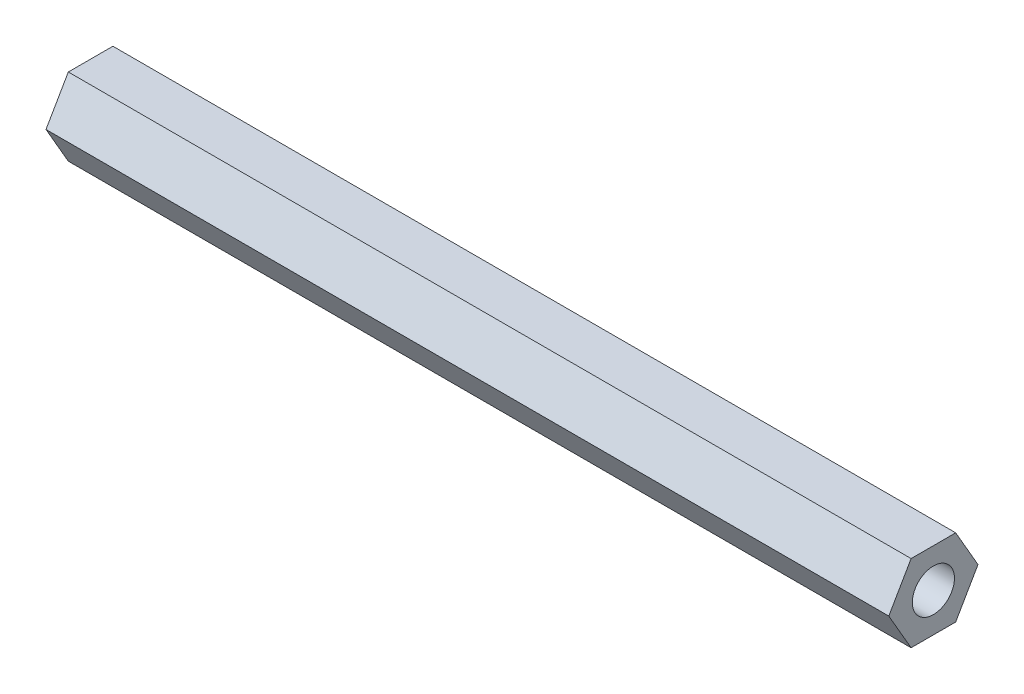
ISO-10303-21;
HEADER;
FILE_DESCRIPTION(('STEP AP214'),'2;1');
FILE_NAME('part.step','',(''),(''),'','','');
FILE_SCHEMA(('AUTOMOTIVE_DESIGN { 1 0 10303 214 1 1 1 1 }'));
ENDSEC;
DATA;
#1=APPLICATION_CONTEXT('core data for automotive mechanical design processes');
#2=APPLICATION_PROTOCOL_DEFINITION('international standard','automotive_design',2000,#1);
#3=PRODUCT_CONTEXT('',#1,'mechanical');
#4=PRODUCT('Part','Part','',(#3));
#5=PRODUCT_RELATED_PRODUCT_CATEGORY('part','',(#4));
#6=PRODUCT_DEFINITION_FORMATION('','',#4);
#7=PRODUCT_DEFINITION_CONTEXT('part definition',#1,'design');
#8=PRODUCT_DEFINITION('design','',#6,#7);
#9=PRODUCT_DEFINITION_SHAPE('','',#8);
#10=(LENGTH_UNIT() NAMED_UNIT(*) SI_UNIT(.MILLI.,.METRE.));
#11=(NAMED_UNIT(*) PLANE_ANGLE_UNIT() SI_UNIT($,.RADIAN.));
#12=(NAMED_UNIT(*) SI_UNIT($,.STERADIAN.) SOLID_ANGLE_UNIT());
#13=UNCERTAINTY_MEASURE_WITH_UNIT(LENGTH_MEASURE(1.E-05),#10,'distance_accuracy_value','');
#14=(GEOMETRIC_REPRESENTATION_CONTEXT(3) GLOBAL_UNCERTAINTY_ASSIGNED_CONTEXT((#13)) GLOBAL_UNIT_ASSIGNED_CONTEXT((#10,
#11,#12)) REPRESENTATION_CONTEXT('',''));
#15=CARTESIAN_POINT('',(0.,0.,0.));
#16=DIRECTION('',(0.,0.,1.));
#17=DIRECTION('',(1.,0.,0.));
#18=AXIS2_PLACEMENT_3D('',#15,#16,#17);
#19=CARTESIAN_POINT('',(60.,-2.75,-1.58771324027147));
#20=DIRECTION('',(0.,0.5,0.866025403784439));
#21=DIRECTION('',(0.,-0.866025403784439,0.5));
#22=AXIS2_PLACEMENT_3D('',#19,#20,#21);
#23=PLANE('',#22);
#24=DIRECTION('',(0.,0.866025403784439,-0.5));
#25=VECTOR('',#24,1.);
#26=CARTESIAN_POINT('',(0.,-2.75,-1.58771324027147));
#27=LINE('',#26,#25);
#28=CARTESIAN_POINT('',(0.,-2.75,-1.58771324027147));
#29=VERTEX_POINT('',#28);
#30=CARTESIAN_POINT('',(0.,0.,-3.17542648054294));
#31=VERTEX_POINT('',#30);
#32=EDGE_CURVE('E127',#29,#31,#27,.T.);
#33=ORIENTED_EDGE('',*,*,#32,.T.);
#34=DIRECTION('',(-1.,0.,0.));
#35=VECTOR('',#34,1.);
#36=CARTESIAN_POINT('',(60.,0.,-3.17542648054294));
#37=LINE('',#36,#35);
#38=CARTESIAN_POINT('',(60.,0.,-3.17542648054294));
#39=VERTEX_POINT('',#38);
#40=EDGE_CURVE('E11',#39,#31,#37,.T.);
#41=ORIENTED_EDGE('',*,*,#40,.F.);
#42=DIRECTION('',(0.,0.866025403784439,-0.5));
#43=VECTOR('',#42,1.);
#44=CARTESIAN_POINT('',(60.,-2.75,-1.58771324027147));
#45=LINE('',#44,#43);
#46=CARTESIAN_POINT('',(60.,-2.75,-1.58771324027147));
#47=VERTEX_POINT('',#46);
#48=EDGE_CURVE('E139',#47,#39,#45,.T.);
#49=ORIENTED_EDGE('',*,*,#48,.F.);
#50=DIRECTION('',(-1.,0.,0.));
#51=VECTOR('',#50,1.);
#52=CARTESIAN_POINT('',(60.,-2.75,-1.58771324027147));
#53=LINE('',#52,#51);
#54=EDGE_CURVE('E124',#47,#29,#53,.T.);
#55=ORIENTED_EDGE('',*,*,#54,.T.);
#56=EDGE_LOOP('',(#33,#41,#49,#55));
#57=FACE_BOUND('',#56,.T.);
#58=ADVANCED_FACE('F41',(#57),#23,.F.);
#59=CARTESIAN_POINT('',(60.,0.,-3.17542648054294));
#60=DIRECTION('',(0.,-0.5,0.866025403784439));
#61=DIRECTION('',(0.,-0.866025403784439,-0.5));
#62=AXIS2_PLACEMENT_3D('',#59,#60,#61);
#63=PLANE('',#62);
#64=DIRECTION('',(0.,0.866025403784439,0.5));
#65=VECTOR('',#64,1.);
#66=CARTESIAN_POINT('',(0.,0.,-3.17542648054294));
#67=LINE('',#66,#65);
#68=CARTESIAN_POINT('',(0.,2.75,-1.58771324027147));
#69=VERTEX_POINT('',#68);
#70=EDGE_CURVE('E129',#31,#69,#67,.T.);
#71=ORIENTED_EDGE('',*,*,#70,.T.);
#72=DIRECTION('',(-1.,0.,0.));
#73=VECTOR('',#72,1.);
#74=CARTESIAN_POINT('',(60.,2.75,-1.58771324027147));
#75=LINE('',#74,#73);
#76=CARTESIAN_POINT('',(60.,2.75,-1.58771324027147));
#77=VERTEX_POINT('',#76);
#78=EDGE_CURVE('E49',#77,#69,#75,.T.);
#79=ORIENTED_EDGE('',*,*,#78,.F.);
#80=DIRECTION('',(0.,0.866025403784439,0.5));
#81=VECTOR('',#80,1.);
#82=CARTESIAN_POINT('',(60.,0.,-3.17542648054294));
#83=LINE('',#82,#81);
#84=EDGE_CURVE('E92',#39,#77,#83,.T.);
#85=ORIENTED_EDGE('',*,*,#84,.F.);
#86=ORIENTED_EDGE('',*,*,#40,.T.);
#87=EDGE_LOOP('',(#71,#79,#85,#86));
#88=FACE_BOUND('',#87,.T.);
#89=ADVANCED_FACE('F162',(#88),#63,.F.);
#90=CARTESIAN_POINT('',(60.,2.75,-1.58771324027147));
#91=DIRECTION('',(0.,-1.,0.));
#92=DIRECTION('',(0.,0.,-1.));
#93=AXIS2_PLACEMENT_3D('',#90,#91,#92);
#94=PLANE('',#93);
#95=DIRECTION('',(0.,0.,1.));
#96=VECTOR('',#95,1.);
#97=CARTESIAN_POINT('',(0.,2.75,-1.58771324027147));
#98=LINE('',#97,#96);
#99=CARTESIAN_POINT('',(0.,2.75,1.58771324027147));
#100=VERTEX_POINT('',#99);
#101=EDGE_CURVE('E131',#69,#100,#98,.T.);
#102=ORIENTED_EDGE('',*,*,#101,.T.);
#103=DIRECTION('',(-1.,0.,0.));
#104=VECTOR('',#103,1.);
#105=CARTESIAN_POINT('',(60.,2.75,1.58771324027147));
#106=LINE('',#105,#104);
#107=CARTESIAN_POINT('',(60.,2.75,1.58771324027147));
#108=VERTEX_POINT('',#107);
#109=EDGE_CURVE('E116',#108,#100,#106,.T.);
#110=ORIENTED_EDGE('',*,*,#109,.F.);
#111=DIRECTION('',(0.,0.,1.));
#112=VECTOR('',#111,1.);
#113=CARTESIAN_POINT('',(60.,2.75,-1.58771324027147));
#114=LINE('',#113,#112);
#115=EDGE_CURVE('E107',#77,#108,#114,.T.);
#116=ORIENTED_EDGE('',*,*,#115,.F.);
#117=ORIENTED_EDGE('',*,*,#78,.T.);
#118=EDGE_LOOP('',(#102,#110,#116,#117));
#119=FACE_BOUND('',#118,.T.);
#120=ADVANCED_FACE('F145',(#119),#94,.F.);
#121=CARTESIAN_POINT('',(60.,2.75,1.58771324027147));
#122=DIRECTION('',(0.,-0.5,-0.866025403784439));
#123=DIRECTION('',(0.,0.866025403784439,-0.5));
#124=AXIS2_PLACEMENT_3D('',#121,#122,#123);
#125=PLANE('',#124);
#126=DIRECTION('',(0.,-0.866025403784438,0.5));
#127=VECTOR('',#126,1.);
#128=CARTESIAN_POINT('',(0.,2.75,1.58771324027147));
#129=LINE('',#128,#127);
#130=CARTESIAN_POINT('',(0.,0.,3.17542648054294));
#131=VERTEX_POINT('',#130);
#132=EDGE_CURVE('E119',#100,#131,#129,.T.);
#133=ORIENTED_EDGE('',*,*,#132,.T.);
#134=DIRECTION('',(-1.,0.,0.));
#135=VECTOR('',#134,1.);
#136=CARTESIAN_POINT('',(60.,0.,3.17542648054294));
#137=LINE('',#136,#135);
#138=CARTESIAN_POINT('',(60.,0.,3.17542648054294));
#139=VERTEX_POINT('',#138);
#140=EDGE_CURVE('E114',#139,#131,#137,.T.);
#141=ORIENTED_EDGE('',*,*,#140,.F.);
#142=DIRECTION('',(0.,-0.866025403784438,0.5));
#143=VECTOR('',#142,1.);
#144=CARTESIAN_POINT('',(60.,2.75,1.58771324027147));
#145=LINE('',#144,#143);
#146=EDGE_CURVE('E105',#108,#139,#145,.T.);
#147=ORIENTED_EDGE('',*,*,#146,.F.);
#148=ORIENTED_EDGE('',*,*,#109,.T.);
#149=EDGE_LOOP('',(#133,#141,#147,#148));
#150=FACE_BOUND('',#149,.T.);
#151=ADVANCED_FACE('F111',(#150),#125,.F.);
#152=CARTESIAN_POINT('',(60.,0.,3.17542648054294));
#153=DIRECTION('',(0.,0.5,-0.866025403784439));
#154=DIRECTION('',(0.,0.866025403784439,0.5));
#155=AXIS2_PLACEMENT_3D('',#152,#153,#154);
#156=PLANE('',#155);
#157=DIRECTION('',(0.,-0.866025403784439,-0.5));
#158=VECTOR('',#157,1.);
#159=CARTESIAN_POINT('',(0.,0.,3.17542648054294));
#160=LINE('',#159,#158);
#161=CARTESIAN_POINT('',(0.,-2.75,1.58771324027147));
#162=VERTEX_POINT('',#161);
#163=EDGE_CURVE('E83',#131,#162,#160,.T.);
#164=ORIENTED_EDGE('',*,*,#163,.T.);
#165=DIRECTION('',(-1.,0.,0.));
#166=VECTOR('',#165,1.);
#167=CARTESIAN_POINT('',(60.,-2.75,1.58771324027147));
#168=LINE('',#167,#166);
#169=CARTESIAN_POINT('',(60.,-2.75,1.58771324027147));
#170=VERTEX_POINT('',#169);
#171=EDGE_CURVE('E120',#170,#162,#168,.T.);
#172=ORIENTED_EDGE('',*,*,#171,.F.);
#173=DIRECTION('',(0.,-0.866025403784439,-0.5));
#174=VECTOR('',#173,1.);
#175=CARTESIAN_POINT('',(60.,0.,3.17542648054294));
#176=LINE('',#175,#174);
#177=EDGE_CURVE('E106',#139,#170,#176,.T.);
#178=ORIENTED_EDGE('',*,*,#177,.F.);
#179=ORIENTED_EDGE('',*,*,#140,.T.);
#180=EDGE_LOOP('',(#164,#172,#178,#179));
#181=FACE_BOUND('',#180,.T.);
#182=ADVANCED_FACE('F117',(#181),#156,.F.);
#183=CARTESIAN_POINT('',(60.,-2.75,1.58771324027147));
#184=DIRECTION('',(0.,1.,0.));
#185=DIRECTION('',(0.,0.,1.));
#186=AXIS2_PLACEMENT_3D('',#183,#184,#185);
#187=PLANE('',#186);
#188=DIRECTION('',(0.,0.,-1.));
#189=VECTOR('',#188,1.);
#190=CARTESIAN_POINT('',(0.,-2.75,1.58771324027147));
#191=LINE('',#190,#189);
#192=EDGE_CURVE('E87',#162,#29,#191,.T.);
#193=ORIENTED_EDGE('',*,*,#192,.T.);
#194=ORIENTED_EDGE('',*,*,#54,.F.);
#195=DIRECTION('',(0.,0.,-1.));
#196=VECTOR('',#195,1.);
#197=CARTESIAN_POINT('',(60.,-2.75,1.58771324027147));
#198=LINE('',#197,#196);
#199=EDGE_CURVE('E59',#170,#47,#198,.T.);
#200=ORIENTED_EDGE('',*,*,#199,.F.);
#201=ORIENTED_EDGE('',*,*,#171,.T.);
#202=EDGE_LOOP('',(#193,#194,#200,#201));
#203=FACE_BOUND('',#202,.T.);
#204=ADVANCED_FACE('F151',(#203),#187,.F.);
#205=CARTESIAN_POINT('',(60.,0.,0.));
#206=DIRECTION('',(1.,0.,0.));
#207=DIRECTION('',(0.,0.,-1.));
#208=AXIS2_PLACEMENT_3D('',#205,#206,#207);
#209=PLANE('',#208);
#210=CARTESIAN_POINT('',(60.,0.,0.));
#211=DIRECTION('',(1.,0.,0.));
#212=DIRECTION('',(0.,0.,-1.));
#213=AXIS2_PLACEMENT_3D('',#210,#211,#212);
#214=CIRCLE('',#213,1.5);
#215=CARTESIAN_POINT('',(60.,0.,-1.5));
#216=VERTEX_POINT('',#215);
#217=EDGE_CURVE('E128',#216,#216,#214,.F.);
#218=ORIENTED_EDGE('',*,*,#217,.T.);
#219=EDGE_LOOP('',(#218));
#220=FACE_BOUND('',#219,.T.);
#221=ORIENTED_EDGE('',*,*,#48,.T.);
#222=ORIENTED_EDGE('',*,*,#84,.T.);
#223=ORIENTED_EDGE('',*,*,#115,.T.);
#224=ORIENTED_EDGE('',*,*,#146,.T.);
#225=ORIENTED_EDGE('',*,*,#177,.T.);
#226=ORIENTED_EDGE('',*,*,#199,.T.);
#227=EDGE_LOOP('',(#221,#222,#223,#224,#225,#226));
#228=FACE_BOUND('',#227,.T.);
#229=ADVANCED_FACE('F102',(#220,#228),#209,.T.);
#230=CARTESIAN_POINT('',(0.,0.,0.));
#231=DIRECTION('',(1.,0.,0.));
#232=DIRECTION('',(0.,0.,-1.));
#233=AXIS2_PLACEMENT_3D('',#230,#231,#232);
#234=PLANE('',#233);
#235=CARTESIAN_POINT('',(0.,0.,0.));
#236=DIRECTION('',(1.,0.,0.));
#237=DIRECTION('',(0.,0.,-1.));
#238=AXIS2_PLACEMENT_3D('',#235,#236,#237);
#239=CIRCLE('',#238,1.5);
#240=CARTESIAN_POINT('',(0.,0.,-1.5));
#241=VERTEX_POINT('',#240);
#242=EDGE_CURVE('E42',#241,#241,#239,.F.);
#243=ORIENTED_EDGE('',*,*,#242,.F.);
#244=EDGE_LOOP('',(#243));
#245=FACE_BOUND('',#244,.T.);
#246=ORIENTED_EDGE('',*,*,#32,.F.);
#247=ORIENTED_EDGE('',*,*,#192,.F.);
#248=ORIENTED_EDGE('',*,*,#163,.F.);
#249=ORIENTED_EDGE('',*,*,#132,.F.);
#250=ORIENTED_EDGE('',*,*,#101,.F.);
#251=ORIENTED_EDGE('',*,*,#70,.F.);
#252=EDGE_LOOP('',(#246,#247,#248,#249,#250,#251));
#253=FACE_BOUND('',#252,.T.);
#254=ADVANCED_FACE('F150',(#245,#253),#234,.F.);
#255=CARTESIAN_POINT('',(-400.,0.,0.));
#256=DIRECTION('',(-1.,0.,0.));
#257=DIRECTION('',(0.,0.,1.));
#258=AXIS2_PLACEMENT_3D('',#255,#256,#257);
#259=CYLINDRICAL_SURFACE('',#258,1.5);
#260=ORIENTED_EDGE('',*,*,#217,.F.);
#261=EDGE_LOOP('',(#260));
#262=FACE_BOUND('',#261,.T.);
#263=ORIENTED_EDGE('',*,*,#242,.T.);
#264=EDGE_LOOP('',(#263));
#265=FACE_BOUND('',#264,.T.);
#266=ADVANCED_FACE('F205',(#262,#265),#259,.F.);
#267=CLOSED_SHELL('',(#58,#89,#120,#151,#182,#204,#229,#254,#266));
#268=MANIFOLD_SOLID_BREP('B2',#267);
#269=ADVANCED_BREP_SHAPE_REPRESENTATION('',(#18,#268),#14);
#270=SHAPE_DEFINITION_REPRESENTATION(#9,#269);
ENDSEC;
END-ISO-10303-21;
